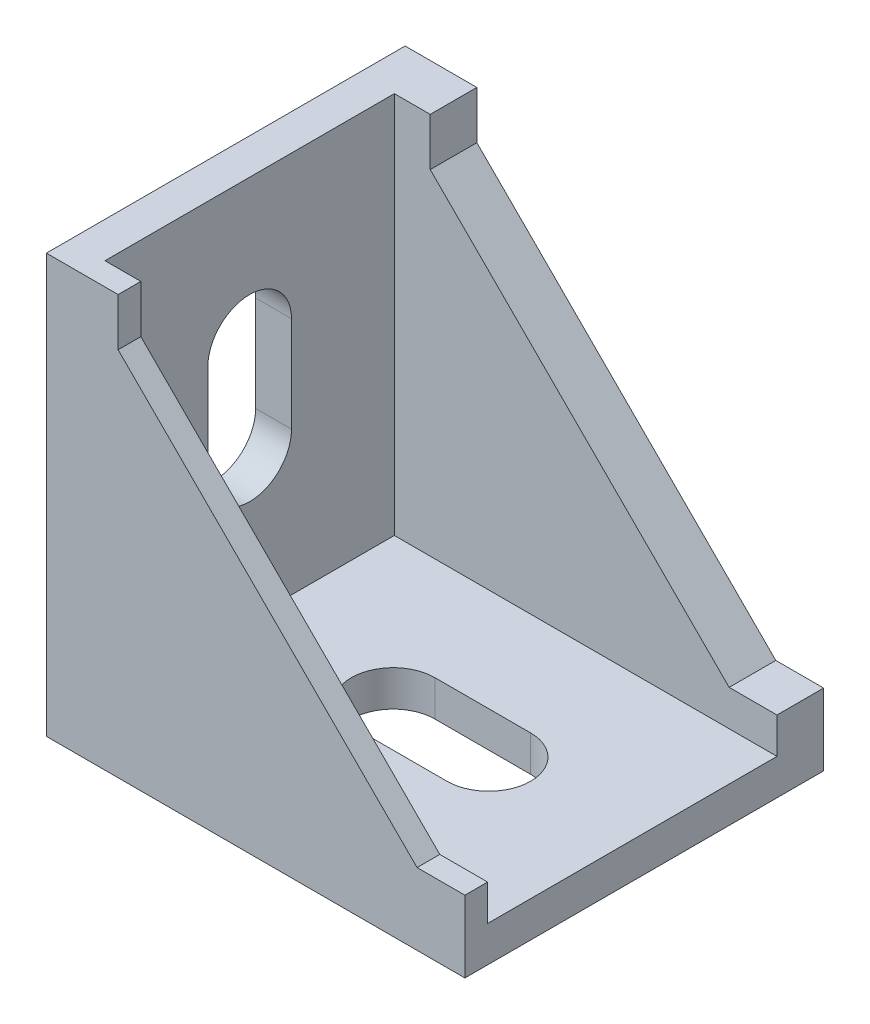
ISO-10303-21;
HEADER;
FILE_DESCRIPTION(('STEP AP214'),'2;1');
FILE_NAME('part.step','',(''),(''),'','','');
FILE_SCHEMA(('AUTOMOTIVE_DESIGN { 1 0 10303 214 1 1 1 1 }'));
ENDSEC;
DATA;
#1=APPLICATION_CONTEXT('core data for automotive mechanical design processes');
#2=APPLICATION_PROTOCOL_DEFINITION('international standard','automotive_design',2000,#1);
#3=PRODUCT_CONTEXT('',#1,'mechanical');
#4=PRODUCT('Part','Part','',(#3));
#5=PRODUCT_RELATED_PRODUCT_CATEGORY('part','',(#4));
#6=PRODUCT_DEFINITION_FORMATION('','',#4);
#7=PRODUCT_DEFINITION_CONTEXT('part definition',#1,'design');
#8=PRODUCT_DEFINITION('design','',#6,#7);
#9=PRODUCT_DEFINITION_SHAPE('','',#8);
#10=(LENGTH_UNIT() NAMED_UNIT(*) SI_UNIT(.MILLI.,.METRE.));
#11=(NAMED_UNIT(*) PLANE_ANGLE_UNIT() SI_UNIT($,.RADIAN.));
#12=(NAMED_UNIT(*) SI_UNIT($,.STERADIAN.) SOLID_ANGLE_UNIT());
#13=UNCERTAINTY_MEASURE_WITH_UNIT(LENGTH_MEASURE(1.E-05),#10,'distance_accuracy_value','');
#14=(GEOMETRIC_REPRESENTATION_CONTEXT(3) GLOBAL_UNCERTAINTY_ASSIGNED_CONTEXT((#13)) GLOBAL_UNIT_ASSIGNED_CONTEXT((#10,
#11,#12)) REPRESENTATION_CONTEXT('',''));
#15=CARTESIAN_POINT('',(0.,0.,0.));
#16=DIRECTION('',(0.,0.,1.));
#17=DIRECTION('',(1.,0.,0.));
#18=AXIS2_PLACEMENT_3D('',#15,#16,#17);
#19=CARTESIAN_POINT('',(3.,17.5,-15.));
#20=DIRECTION('',(0.,1.,0.));
#21=DIRECTION('',(-1.,0.,0.));
#22=AXIS2_PLACEMENT_3D('',#19,#20,#21);
#23=PLANE('',#22);
#24=DIRECTION('',(0.,0.,1.));
#25=VECTOR('',#24,1.);
#26=CARTESIAN_POINT('',(1.50000000000003,17.5,-13.05));
#27=LINE('',#26,#25);
#28=CARTESIAN_POINT('',(1.50000000000003,17.5,-13.05));
#29=VERTEX_POINT('',#28);
#30=CARTESIAN_POINT('',(1.50000000000003,17.5,-0.95));
#31=VERTEX_POINT('',#30);
#32=EDGE_CURVE('E253',#29,#31,#27,.T.);
#33=ORIENTED_EDGE('',*,*,#32,.F.);
#34=DIRECTION('',(-1.,0.,0.));
#35=VECTOR('',#34,1.);
#36=CARTESIAN_POINT('',(3.,17.5,-13.05));
#37=LINE('',#36,#35);
#38=CARTESIAN_POINT('',(3.,17.5,-13.05));
#39=VERTEX_POINT('',#38);
#40=EDGE_CURVE('E241',#39,#29,#37,.T.);
#41=ORIENTED_EDGE('',*,*,#40,.F.);
#42=DIRECTION('',(0.,0.,1.));
#43=VECTOR('',#42,1.);
#44=CARTESIAN_POINT('',(3.,17.5,-15.));
#45=LINE('',#44,#43);
#46=CARTESIAN_POINT('',(3.,17.5,-15.));
#47=VERTEX_POINT('',#46);
#48=EDGE_CURVE('E328',#47,#39,#45,.T.);
#49=ORIENTED_EDGE('',*,*,#48,.F.);
#50=DIRECTION('',(-1.,0.,0.));
#51=VECTOR('',#50,1.);
#52=CARTESIAN_POINT('',(3.,17.5,-15.));
#53=LINE('',#52,#51);
#54=CARTESIAN_POINT('',(0.,17.5,-15.));
#55=VERTEX_POINT('',#54);
#56=EDGE_CURVE('E286',#47,#55,#53,.T.);
#57=ORIENTED_EDGE('',*,*,#56,.T.);
#58=DIRECTION('',(0.,0.,1.));
#59=VECTOR('',#58,1.);
#60=CARTESIAN_POINT('',(0.,17.5,-15.));
#61=LINE('',#60,#59);
#62=CARTESIAN_POINT('',(0.,17.5,0.));
#63=VERTEX_POINT('',#62);
#64=EDGE_CURVE('E308',#55,#63,#61,.T.);
#65=ORIENTED_EDGE('',*,*,#64,.T.);
#66=DIRECTION('',(-1.,0.,0.));
#67=VECTOR('',#66,1.);
#68=CARTESIAN_POINT('',(3.,17.5,0.));
#69=LINE('',#68,#67);
#70=CARTESIAN_POINT('',(3.,17.5,0.));
#71=VERTEX_POINT('',#70);
#72=EDGE_CURVE('E285',#71,#63,#69,.T.);
#73=ORIENTED_EDGE('',*,*,#72,.F.);
#74=CARTESIAN_POINT('',(3.,17.5,-0.95));
#75=VERTEX_POINT('',#74);
#76=EDGE_CURVE('E332',#75,#71,#45,.T.);
#77=ORIENTED_EDGE('',*,*,#76,.F.);
#78=DIRECTION('',(-1.,0.,0.));
#79=VECTOR('',#78,1.);
#80=CARTESIAN_POINT('',(3.,17.5,-0.95));
#81=LINE('',#80,#79);
#82=EDGE_CURVE('E233',#75,#31,#81,.T.);
#83=ORIENTED_EDGE('',*,*,#82,.T.);
#84=EDGE_LOOP('',(#33,#41,#49,#57,#65,#73,#77,#83));
#85=FACE_BOUND('',#84,.T.);
#86=ADVANCED_FACE('F33',(#85),#23,.T.);
#87=CARTESIAN_POINT('',(3.,15.5,-15.));
#88=DIRECTION('',(1.,0.,0.));
#89=DIRECTION('',(0.,1.,0.));
#90=AXIS2_PLACEMENT_3D('',#87,#88,#89);
#91=PLANE('',#90);
#92=ORIENTED_EDGE('',*,*,#48,.T.);
#93=DIRECTION('',(0.,-1.,0.));
#94=VECTOR('',#93,1.);
#95=CARTESIAN_POINT('',(3.,15.5,-13.05));
#96=LINE('',#95,#94);
#97=CARTESIAN_POINT('',(3.,15.5,-13.05));
#98=VERTEX_POINT('',#97);
#99=EDGE_CURVE('E282',#39,#98,#96,.T.);
#100=ORIENTED_EDGE('',*,*,#99,.T.);
#101=DIRECTION('',(0.,0.,1.));
#102=VECTOR('',#101,1.);
#103=CARTESIAN_POINT('',(3.,15.5,-15.));
#104=LINE('',#103,#102);
#105=CARTESIAN_POINT('',(3.,15.5,-15.));
#106=VERTEX_POINT('',#105);
#107=EDGE_CURVE('E333',#106,#98,#104,.T.);
#108=ORIENTED_EDGE('',*,*,#107,.F.);
#109=DIRECTION('',(0.,1.,0.));
#110=VECTOR('',#109,1.);
#111=CARTESIAN_POINT('',(3.,15.5,-15.));
#112=LINE('',#111,#110);
#113=EDGE_CURVE('E305',#106,#47,#112,.T.);
#114=ORIENTED_EDGE('',*,*,#113,.T.);
#115=EDGE_LOOP('',(#92,#100,#108,#114));
#116=FACE_BOUND('',#115,.T.);
#117=ADVANCED_FACE('F385',(#116),#91,.T.);
#118=CARTESIAN_POINT('',(15.5000000000003,3.,-15.));
#119=DIRECTION('',(0.707106781186539,0.707106781186556,0.));
#120=DIRECTION('',(-0.707106781186556,0.707106781186539,0.));
#121=AXIS2_PLACEMENT_3D('',#118,#119,#120);
#122=PLANE('',#121);
#123=ORIENTED_EDGE('',*,*,#107,.T.);
#124=DIRECTION('',(0.707106781186556,-0.707106781186539,0.));
#125=VECTOR('',#124,1.);
#126=CARTESIAN_POINT('',(15.5000000000003,3.,-13.05));
#127=LINE('',#126,#125);
#128=CARTESIAN_POINT('',(15.5000000000003,3.,-13.05));
#129=VERTEX_POINT('',#128);
#130=EDGE_CURVE('E279',#98,#129,#127,.T.);
#131=ORIENTED_EDGE('',*,*,#130,.T.);
#132=DIRECTION('',(0.,0.,1.));
#133=VECTOR('',#132,1.);
#134=CARTESIAN_POINT('',(15.5000000000003,3.,-15.));
#135=LINE('',#134,#133);
#136=CARTESIAN_POINT('',(15.5000000000003,3.,-15.));
#137=VERTEX_POINT('',#136);
#138=EDGE_CURVE('E337',#137,#129,#135,.T.);
#139=ORIENTED_EDGE('',*,*,#138,.F.);
#140=DIRECTION('',(-0.707106781186556,0.707106781186539,0.));
#141=VECTOR('',#140,1.);
#142=CARTESIAN_POINT('',(15.5000000000003,3.,-15.));
#143=LINE('',#142,#141);
#144=EDGE_CURVE('E302',#137,#106,#143,.T.);
#145=ORIENTED_EDGE('',*,*,#144,.T.);
#146=EDGE_LOOP('',(#123,#131,#139,#145));
#147=FACE_BOUND('',#146,.T.);
#148=ADVANCED_FACE('F390',(#147),#122,.T.);
#149=CARTESIAN_POINT('',(17.5,3.,-15.));
#150=DIRECTION('',(0.,1.,0.));
#151=DIRECTION('',(-1.,0.,0.));
#152=AXIS2_PLACEMENT_3D('',#149,#150,#151);
#153=PLANE('',#152);
#154=ORIENTED_EDGE('',*,*,#138,.T.);
#155=DIRECTION('',(1.,0.,0.));
#156=VECTOR('',#155,1.);
#157=CARTESIAN_POINT('',(17.5,3.,-13.05));
#158=LINE('',#157,#156);
#159=CARTESIAN_POINT('',(17.5,3.,-13.05));
#160=VERTEX_POINT('',#159);
#161=EDGE_CURVE('E276',#129,#160,#158,.T.);
#162=ORIENTED_EDGE('',*,*,#161,.T.);
#163=DIRECTION('',(0.,0.,1.));
#164=VECTOR('',#163,1.);
#165=CARTESIAN_POINT('',(17.5,3.,-15.));
#166=LINE('',#165,#164);
#167=CARTESIAN_POINT('',(17.5,3.,-15.));
#168=VERTEX_POINT('',#167);
#169=EDGE_CURVE('E341',#168,#160,#166,.T.);
#170=ORIENTED_EDGE('',*,*,#169,.F.);
#171=DIRECTION('',(-1.,0.,0.));
#172=VECTOR('',#171,1.);
#173=CARTESIAN_POINT('',(17.5,3.,-15.));
#174=LINE('',#173,#172);
#175=EDGE_CURVE('E299',#168,#137,#174,.T.);
#176=ORIENTED_EDGE('',*,*,#175,.T.);
#177=EDGE_LOOP('',(#154,#162,#170,#176));
#178=FACE_BOUND('',#177,.T.);
#179=ADVANCED_FACE('F412',(#178),#153,.T.);
#180=CARTESIAN_POINT('',(17.5,0.,-15.));
#181=DIRECTION('',(1.,0.,0.));
#182=DIRECTION('',(0.,1.,0.));
#183=AXIS2_PLACEMENT_3D('',#180,#181,#182);
#184=PLANE('',#183);
#185=ORIENTED_EDGE('',*,*,#169,.T.);
#186=DIRECTION('',(0.,1.,0.));
#187=VECTOR('',#186,1.);
#188=CARTESIAN_POINT('',(17.5,1.5,-13.05));
#189=LINE('',#188,#187);
#190=CARTESIAN_POINT('',(17.5,1.5,-13.05));
#191=VERTEX_POINT('',#190);
#192=EDGE_CURVE('E251',#191,#160,#189,.T.);
#193=ORIENTED_EDGE('',*,*,#192,.F.);
#194=DIRECTION('',(0.,0.,1.));
#195=VECTOR('',#194,1.);
#196=CARTESIAN_POINT('',(17.5,1.5,-13.05));
#197=LINE('',#196,#195);
#198=CARTESIAN_POINT('',(17.5,1.5,-0.95));
#199=VERTEX_POINT('',#198);
#200=EDGE_CURVE('E264',#191,#199,#197,.T.);
#201=ORIENTED_EDGE('',*,*,#200,.T.);
#202=DIRECTION('',(0.,1.,0.));
#203=VECTOR('',#202,1.);
#204=CARTESIAN_POINT('',(17.5,1.5,-0.95));
#205=LINE('',#204,#203);
#206=CARTESIAN_POINT('',(17.5,3.,-0.95));
#207=VERTEX_POINT('',#206);
#208=EDGE_CURVE('E245',#199,#207,#205,.T.);
#209=ORIENTED_EDGE('',*,*,#208,.T.);
#210=CARTESIAN_POINT('',(17.5,3.,0.));
#211=VERTEX_POINT('',#210);
#212=EDGE_CURVE('E344',#207,#211,#166,.T.);
#213=ORIENTED_EDGE('',*,*,#212,.T.);
#214=DIRECTION('',(0.,1.,0.));
#215=VECTOR('',#214,1.);
#216=CARTESIAN_POINT('',(17.5,0.,0.));
#217=LINE('',#216,#215);
#218=CARTESIAN_POINT('',(17.5,0.,0.));
#219=VERTEX_POINT('',#218);
#220=EDGE_CURVE('E317',#219,#211,#217,.T.);
#221=ORIENTED_EDGE('',*,*,#220,.F.);
#222=DIRECTION('',(0.,0.,1.));
#223=VECTOR('',#222,1.);
#224=CARTESIAN_POINT('',(17.5,0.,-15.));
#225=LINE('',#224,#223);
#226=CARTESIAN_POINT('',(17.5,0.,-15.));
#227=VERTEX_POINT('',#226);
#228=EDGE_CURVE('E345',#227,#219,#225,.T.);
#229=ORIENTED_EDGE('',*,*,#228,.F.);
#230=DIRECTION('',(0.,1.,0.));
#231=VECTOR('',#230,1.);
#232=CARTESIAN_POINT('',(17.5,0.,-15.));
#233=LINE('',#232,#231);
#234=EDGE_CURVE('E296',#227,#168,#233,.T.);
#235=ORIENTED_EDGE('',*,*,#234,.T.);
#236=EDGE_LOOP('',(#185,#193,#201,#209,#213,#221,#229,#235));
#237=FACE_BOUND('',#236,.T.);
#238=ADVANCED_FACE('F407',(#237),#184,.T.);
#239=DIRECTION('',(0.,-1.,0.));
#240=VECTOR('',#239,1.);
#241=CARTESIAN_POINT('',(3.,15.5,-0.95));
#242=LINE('',#241,#240);
#243=CARTESIAN_POINT('',(3.,15.5,-0.95));
#244=VERTEX_POINT('',#243);
#245=EDGE_CURVE('E274',#75,#244,#242,.T.);
#246=ORIENTED_EDGE('',*,*,#245,.F.);
#247=ORIENTED_EDGE('',*,*,#76,.T.);
#248=DIRECTION('',(0.,1.,0.));
#249=VECTOR('',#248,1.);
#250=CARTESIAN_POINT('',(3.,15.5,0.));
#251=LINE('',#250,#249);
#252=CARTESIAN_POINT('',(3.,15.5,0.));
#253=VERTEX_POINT('',#252);
#254=EDGE_CURVE('E290',#253,#71,#251,.T.);
#255=ORIENTED_EDGE('',*,*,#254,.F.);
#256=EDGE_CURVE('E336',#244,#253,#104,.T.);
#257=ORIENTED_EDGE('',*,*,#256,.F.);
#258=EDGE_LOOP('',(#246,#247,#255,#257));
#259=FACE_BOUND('',#258,.T.);
#260=ADVANCED_FACE('F393',(#259),#91,.T.);
#261=DIRECTION('',(0.707106781186556,-0.707106781186539,0.));
#262=VECTOR('',#261,1.);
#263=CARTESIAN_POINT('',(15.5000000000003,3.,-0.95));
#264=LINE('',#263,#262);
#265=CARTESIAN_POINT('',(15.5000000000003,3.,-0.95));
#266=VERTEX_POINT('',#265);
#267=EDGE_CURVE('E272',#244,#266,#264,.T.);
#268=ORIENTED_EDGE('',*,*,#267,.F.);
#269=ORIENTED_EDGE('',*,*,#256,.T.);
#270=DIRECTION('',(-0.707106781186556,0.707106781186539,0.));
#271=VECTOR('',#270,1.);
#272=CARTESIAN_POINT('',(15.5000000000003,3.,0.));
#273=LINE('',#272,#271);
#274=CARTESIAN_POINT('',(15.5000000000003,3.,0.));
#275=VERTEX_POINT('',#274);
#276=EDGE_CURVE('E323',#275,#253,#273,.T.);
#277=ORIENTED_EDGE('',*,*,#276,.F.);
#278=EDGE_CURVE('E340',#266,#275,#135,.T.);
#279=ORIENTED_EDGE('',*,*,#278,.F.);
#280=EDGE_LOOP('',(#268,#269,#277,#279));
#281=FACE_BOUND('',#280,.T.);
#282=ADVANCED_FACE('F435',(#281),#122,.T.);
#283=DIRECTION('',(1.,0.,0.));
#284=VECTOR('',#283,1.);
#285=CARTESIAN_POINT('',(17.5,3.,-0.95));
#286=LINE('',#285,#284);
#287=EDGE_CURVE('E267',#266,#207,#286,.T.);
#288=ORIENTED_EDGE('',*,*,#287,.F.);
#289=ORIENTED_EDGE('',*,*,#278,.T.);
#290=DIRECTION('',(-1.,0.,0.));
#291=VECTOR('',#290,1.);
#292=CARTESIAN_POINT('',(17.5,3.,0.));
#293=LINE('',#292,#291);
#294=EDGE_CURVE('E320',#211,#275,#293,.T.);
#295=ORIENTED_EDGE('',*,*,#294,.F.);
#296=ORIENTED_EDGE('',*,*,#212,.F.);
#297=EDGE_LOOP('',(#288,#289,#295,#296));
#298=FACE_BOUND('',#297,.T.);
#299=ADVANCED_FACE('F438',(#298),#153,.T.);
#300=CARTESIAN_POINT('',(0.,0.,-15.));
#301=DIRECTION('',(0.,-1.,0.));
#302=DIRECTION('',(0.,0.,-1.));
#303=AXIS2_PLACEMENT_3D('',#300,#301,#302);
#304=PLANE('',#303);
#305=CARTESIAN_POINT('',(7.50000000000003,0.,-7.));
#306=DIRECTION('',(0.,1.,0.));
#307=DIRECTION('',(0.,0.,1.));
#308=AXIS2_PLACEMENT_3D('',#305,#306,#307);
#309=CIRCLE('',#308,1.75);
#310=CARTESIAN_POINT('',(7.50000000000003,0.,-8.75));
#311=VERTEX_POINT('',#310);
#312=CARTESIAN_POINT('',(7.50000000000003,0.,-5.25));
#313=VERTEX_POINT('',#312);
#314=EDGE_CURVE('E214',#311,#313,#309,.T.);
#315=ORIENTED_EDGE('',*,*,#314,.T.);
#316=DIRECTION('',(1.,0.,0.));
#317=VECTOR('',#316,1.);
#318=CARTESIAN_POINT('',(7.50000000000003,0.,-5.25));
#319=LINE('',#318,#317);
#320=CARTESIAN_POINT('',(11.5,0.,-5.25));
#321=VERTEX_POINT('',#320);
#322=EDGE_CURVE('E220',#313,#321,#319,.T.);
#323=ORIENTED_EDGE('',*,*,#322,.T.);
#324=CARTESIAN_POINT('',(11.5,0.,-7.));
#325=DIRECTION('',(0.,1.,0.));
#326=DIRECTION('',(0.,0.,1.));
#327=AXIS2_PLACEMENT_3D('',#324,#325,#326);
#328=CIRCLE('',#327,1.75);
#329=CARTESIAN_POINT('',(11.5,0.,-8.75));
#330=VERTEX_POINT('',#329);
#331=EDGE_CURVE('E223',#321,#330,#328,.T.);
#332=ORIENTED_EDGE('',*,*,#331,.T.);
#333=DIRECTION('',(-1.,0.,0.));
#334=VECTOR('',#333,1.);
#335=CARTESIAN_POINT('',(7.50000000000003,0.,-8.75));
#336=LINE('',#335,#334);
#337=EDGE_CURVE('E226',#330,#311,#336,.T.);
#338=ORIENTED_EDGE('',*,*,#337,.T.);
#339=EDGE_LOOP('',(#315,#323,#332,#338));
#340=FACE_BOUND('',#339,.T.);
#341=DIRECTION('',(1.,0.,0.));
#342=VECTOR('',#341,1.);
#343=CARTESIAN_POINT('',(0.,0.,0.));
#344=LINE('',#343,#342);
#345=CARTESIAN_POINT('',(0.,0.,0.));
#346=VERTEX_POINT('',#345);
#347=EDGE_CURVE('E314',#346,#219,#344,.T.);
#348=ORIENTED_EDGE('',*,*,#347,.F.);
#349=DIRECTION('',(0.,0.,1.));
#350=VECTOR('',#349,1.);
#351=CARTESIAN_POINT('',(0.,0.,-15.));
#352=LINE('',#351,#350);
#353=CARTESIAN_POINT('',(0.,0.,-15.));
#354=VERTEX_POINT('',#353);
#355=EDGE_CURVE('E347',#354,#346,#352,.T.);
#356=ORIENTED_EDGE('',*,*,#355,.F.);
#357=DIRECTION('',(1.,0.,0.));
#358=VECTOR('',#357,1.);
#359=CARTESIAN_POINT('',(0.,0.,-15.));
#360=LINE('',#359,#358);
#361=EDGE_CURVE('E293',#354,#227,#360,.T.);
#362=ORIENTED_EDGE('',*,*,#361,.T.);
#363=ORIENTED_EDGE('',*,*,#228,.T.);
#364=EDGE_LOOP('',(#348,#356,#362,#363));
#365=FACE_BOUND('',#364,.T.);
#366=ADVANCED_FACE('F367',(#340,#365),#304,.T.);
#367=CARTESIAN_POINT('',(0.,17.5,-15.));
#368=DIRECTION('',(-1.,0.,0.));
#369=DIRECTION('',(0.,-1.,0.));
#370=AXIS2_PLACEMENT_3D('',#367,#368,#369);
#371=PLANE('',#370);
#372=CARTESIAN_POINT('',(0.,7.5,-7.));
#373=DIRECTION('',(1.,0.,0.));
#374=DIRECTION('',(0.,1.,0.));
#375=AXIS2_PLACEMENT_3D('',#372,#373,#374);
#376=CIRCLE('',#375,1.75);
#377=CARTESIAN_POINT('',(0.,7.5,-5.25));
#378=VERTEX_POINT('',#377);
#379=CARTESIAN_POINT('',(0.,7.5,-8.75));
#380=VERTEX_POINT('',#379);
#381=EDGE_CURVE('E183',#378,#380,#376,.T.);
#382=ORIENTED_EDGE('',*,*,#381,.T.);
#383=DIRECTION('',(0.,1.,0.));
#384=VECTOR('',#383,1.);
#385=CARTESIAN_POINT('',(0.,7.5,-8.75));
#386=LINE('',#385,#384);
#387=CARTESIAN_POINT('',(0.,11.5,-8.75));
#388=VERTEX_POINT('',#387);
#389=EDGE_CURVE('E192',#380,#388,#386,.T.);
#390=ORIENTED_EDGE('',*,*,#389,.T.);
#391=CARTESIAN_POINT('',(0.,11.5,-7.));
#392=DIRECTION('',(1.,0.,0.));
#393=DIRECTION('',(0.,1.,0.));
#394=AXIS2_PLACEMENT_3D('',#391,#392,#393);
#395=CIRCLE('',#394,1.75);
#396=CARTESIAN_POINT('',(0.,11.5,-5.25));
#397=VERTEX_POINT('',#396);
#398=EDGE_CURVE('E47',#388,#397,#395,.T.);
#399=ORIENTED_EDGE('',*,*,#398,.T.);
#400=DIRECTION('',(0.,-1.,0.));
#401=VECTOR('',#400,1.);
#402=CARTESIAN_POINT('',(0.,7.5,-5.25));
#403=LINE('',#402,#401);
#404=EDGE_CURVE('E189',#397,#378,#403,.T.);
#405=ORIENTED_EDGE('',*,*,#404,.T.);
#406=EDGE_LOOP('',(#382,#390,#399,#405));
#407=FACE_BOUND('',#406,.T.);
#408=DIRECTION('',(0.,-1.,0.));
#409=VECTOR('',#408,1.);
#410=CARTESIAN_POINT('',(0.,17.5,0.));
#411=LINE('',#410,#409);
#412=EDGE_CURVE('E311',#63,#346,#411,.T.);
#413=ORIENTED_EDGE('',*,*,#412,.F.);
#414=ORIENTED_EDGE('',*,*,#64,.F.);
#415=DIRECTION('',(0.,-1.,0.));
#416=VECTOR('',#415,1.);
#417=CARTESIAN_POINT('',(0.,17.5,-15.));
#418=LINE('',#417,#416);
#419=EDGE_CURVE('E289',#55,#354,#418,.T.);
#420=ORIENTED_EDGE('',*,*,#419,.T.);
#421=ORIENTED_EDGE('',*,*,#355,.T.);
#422=EDGE_LOOP('',(#413,#414,#420,#421));
#423=FACE_BOUND('',#422,.T.);
#424=ADVANCED_FACE('F196',(#407,#423),#371,.T.);
#425=CARTESIAN_POINT('',(0.,0.,-15.));
#426=DIRECTION('',(0.,0.,1.));
#427=DIRECTION('',(1.,0.,0.));
#428=AXIS2_PLACEMENT_3D('',#425,#426,#427);
#429=PLANE('',#428);
#430=ORIENTED_EDGE('',*,*,#56,.F.);
#431=ORIENTED_EDGE('',*,*,#113,.F.);
#432=ORIENTED_EDGE('',*,*,#144,.F.);
#433=ORIENTED_EDGE('',*,*,#175,.F.);
#434=ORIENTED_EDGE('',*,*,#234,.F.);
#435=ORIENTED_EDGE('',*,*,#361,.F.);
#436=ORIENTED_EDGE('',*,*,#419,.F.);
#437=EDGE_LOOP('',(#430,#431,#432,#433,#434,#435,#436));
#438=FACE_BOUND('',#437,.T.);
#439=ADVANCED_FACE('F419',(#438),#429,.F.);
#440=CARTESIAN_POINT('',(0.,0.,0.));
#441=DIRECTION('',(0.,0.,1.));
#442=DIRECTION('',(1.,0.,0.));
#443=AXIS2_PLACEMENT_3D('',#440,#441,#442);
#444=PLANE('',#443);
#445=ORIENTED_EDGE('',*,*,#72,.T.);
#446=ORIENTED_EDGE('',*,*,#412,.T.);
#447=ORIENTED_EDGE('',*,*,#347,.T.);
#448=ORIENTED_EDGE('',*,*,#220,.T.);
#449=ORIENTED_EDGE('',*,*,#294,.T.);
#450=ORIENTED_EDGE('',*,*,#276,.T.);
#451=ORIENTED_EDGE('',*,*,#254,.T.);
#452=EDGE_LOOP('',(#445,#446,#447,#448,#449,#450,#451));
#453=FACE_BOUND('',#452,.T.);
#454=ADVANCED_FACE('F426',(#453),#444,.T.);
#455=CARTESIAN_POINT('',(1.50000000000004,1.5,-13.05));
#456=DIRECTION('',(0.,-1.,0.));
#457=DIRECTION('',(0.,0.,-1.));
#458=AXIS2_PLACEMENT_3D('',#455,#456,#457);
#459=PLANE('',#458);
#460=DIRECTION('',(-1.,0.,0.));
#461=VECTOR('',#460,1.);
#462=CARTESIAN_POINT('',(1.50000000000004,1.5,-5.25));
#463=LINE('',#462,#461);
#464=CARTESIAN_POINT('',(11.5,1.5,-5.25));
#465=VERTEX_POINT('',#464);
#466=CARTESIAN_POINT('',(7.50000000000003,1.5,-5.25));
#467=VERTEX_POINT('',#466);
#468=EDGE_CURVE('E331',#465,#467,#463,.T.);
#469=ORIENTED_EDGE('',*,*,#468,.T.);
#470=CARTESIAN_POINT('',(7.50000000000003,1.5,-7.));
#471=DIRECTION('',(0.,-1.,0.));
#472=DIRECTION('',(0.,0.,-1.));
#473=AXIS2_PLACEMENT_3D('',#470,#471,#472);
#474=CIRCLE('',#473,1.75);
#475=CARTESIAN_POINT('',(7.50000000000003,1.5,-8.75));
#476=VERTEX_POINT('',#475);
#477=EDGE_CURVE('E11',#467,#476,#474,.T.);
#478=ORIENTED_EDGE('',*,*,#477,.T.);
#479=DIRECTION('',(1.,0.,0.));
#480=VECTOR('',#479,1.);
#481=CARTESIAN_POINT('',(1.50000000000004,1.5,-8.75));
#482=LINE('',#481,#480);
#483=CARTESIAN_POINT('',(11.5,1.5,-8.75));
#484=VERTEX_POINT('',#483);
#485=EDGE_CURVE('E40',#476,#484,#482,.T.);
#486=ORIENTED_EDGE('',*,*,#485,.T.);
#487=CARTESIAN_POINT('',(11.5,1.5,-7.));
#488=DIRECTION('',(0.,-1.,0.));
#489=DIRECTION('',(0.,0.,-1.));
#490=AXIS2_PLACEMENT_3D('',#487,#488,#489);
#491=CIRCLE('',#490,1.75);
#492=EDGE_CURVE('E352',#484,#465,#491,.T.);
#493=ORIENTED_EDGE('',*,*,#492,.T.);
#494=EDGE_LOOP('',(#469,#478,#486,#493));
#495=FACE_BOUND('',#494,.T.);
#496=DIRECTION('',(1.,0.,0.));
#497=VECTOR('',#496,1.);
#498=CARTESIAN_POINT('',(1.50000000000004,1.5,-0.95));
#499=LINE('',#498,#497);
#500=CARTESIAN_POINT('',(1.50000000000004,1.5,-0.95));
#501=VERTEX_POINT('',#500);
#502=EDGE_CURVE('E259',#501,#199,#499,.T.);
#503=ORIENTED_EDGE('',*,*,#502,.T.);
#504=ORIENTED_EDGE('',*,*,#200,.F.);
#505=DIRECTION('',(1.,0.,0.));
#506=VECTOR('',#505,1.);
#507=CARTESIAN_POINT('',(1.50000000000004,1.5,-13.05));
#508=LINE('',#507,#506);
#509=CARTESIAN_POINT('',(1.50000000000004,1.5,-13.05));
#510=VERTEX_POINT('',#509);
#511=EDGE_CURVE('E248',#510,#191,#508,.T.);
#512=ORIENTED_EDGE('',*,*,#511,.F.);
#513=DIRECTION('',(0.,0.,1.));
#514=VECTOR('',#513,1.);
#515=CARTESIAN_POINT('',(1.50000000000004,1.5,-13.05));
#516=LINE('',#515,#514);
#517=EDGE_CURVE('E268',#510,#501,#516,.T.);
#518=ORIENTED_EDGE('',*,*,#517,.T.);
#519=EDGE_LOOP('',(#503,#504,#512,#518));
#520=FACE_BOUND('',#519,.T.);
#521=ADVANCED_FACE('F356',(#495,#520),#459,.F.);
#522=CARTESIAN_POINT('',(1.50000000000003,17.5,-13.05));
#523=DIRECTION('',(-1.,0.,0.));
#524=DIRECTION('',(0.,-1.,0.));
#525=AXIS2_PLACEMENT_3D('',#522,#523,#524);
#526=PLANE('',#525);
#527=DIRECTION('',(0.,1.,0.));
#528=VECTOR('',#527,1.);
#529=CARTESIAN_POINT('',(1.50000000000004,7.5,-8.75));
#530=LINE('',#529,#528);
#531=CARTESIAN_POINT('',(1.50000000000004,7.50000000000001,-8.75));
#532=VERTEX_POINT('',#531);
#533=CARTESIAN_POINT('',(1.50000000000003,11.5,-8.75));
#534=VERTEX_POINT('',#533);
#535=EDGE_CURVE('E208',#532,#534,#530,.T.);
#536=ORIENTED_EDGE('',*,*,#535,.F.);
#537=CARTESIAN_POINT('',(1.50000000000004,7.5,-7.));
#538=DIRECTION('',(1.,0.,0.));
#539=DIRECTION('',(0.,1.,0.));
#540=AXIS2_PLACEMENT_3D('',#537,#538,#539);
#541=CIRCLE('',#540,1.75);
#542=CARTESIAN_POINT('',(1.50000000000004,7.5,-5.25));
#543=VERTEX_POINT('',#542);
#544=EDGE_CURVE('E55',#543,#532,#541,.T.);
#545=ORIENTED_EDGE('',*,*,#544,.F.);
#546=DIRECTION('',(0.,-1.,0.));
#547=VECTOR('',#546,1.);
#548=CARTESIAN_POINT('',(1.50000000000004,7.5,-5.25));
#549=LINE('',#548,#547);
#550=CARTESIAN_POINT('',(1.50000000000003,11.5,-5.25));
#551=VERTEX_POINT('',#550);
#552=EDGE_CURVE('E199',#551,#543,#549,.T.);
#553=ORIENTED_EDGE('',*,*,#552,.F.);
#554=CARTESIAN_POINT('',(1.50000000000003,11.5,-7.));
#555=DIRECTION('',(1.,0.,0.));
#556=DIRECTION('',(0.,1.,0.));
#557=AXIS2_PLACEMENT_3D('',#554,#555,#556);
#558=CIRCLE('',#557,1.75);
#559=EDGE_CURVE('E202',#534,#551,#558,.T.);
#560=ORIENTED_EDGE('',*,*,#559,.F.);
#561=EDGE_LOOP('',(#536,#545,#553,#560));
#562=FACE_BOUND('',#561,.T.);
#563=DIRECTION('',(0.,-1.,0.));
#564=VECTOR('',#563,1.);
#565=CARTESIAN_POINT('',(1.50000000000003,17.5,-0.95));
#566=LINE('',#565,#564);
#567=EDGE_CURVE('E256',#31,#501,#566,.T.);
#568=ORIENTED_EDGE('',*,*,#567,.T.);
#569=ORIENTED_EDGE('',*,*,#517,.F.);
#570=DIRECTION('',(0.,-1.,0.));
#571=VECTOR('',#570,1.);
#572=CARTESIAN_POINT('',(1.50000000000003,17.5,-13.05));
#573=LINE('',#572,#571);
#574=EDGE_CURVE('E244',#29,#510,#573,.T.);
#575=ORIENTED_EDGE('',*,*,#574,.F.);
#576=ORIENTED_EDGE('',*,*,#32,.T.);
#577=EDGE_LOOP('',(#568,#569,#575,#576));
#578=FACE_BOUND('',#577,.T.);
#579=ADVANCED_FACE('F399',(#562,#578),#526,.F.);
#580=CARTESIAN_POINT('',(0.,0.,-13.05));
#581=DIRECTION('',(0.,0.,1.));
#582=DIRECTION('',(1.,0.,0.));
#583=AXIS2_PLACEMENT_3D('',#580,#581,#582);
#584=PLANE('',#583);
#585=ORIENTED_EDGE('',*,*,#40,.T.);
#586=ORIENTED_EDGE('',*,*,#574,.T.);
#587=ORIENTED_EDGE('',*,*,#511,.T.);
#588=ORIENTED_EDGE('',*,*,#192,.T.);
#589=ORIENTED_EDGE('',*,*,#161,.F.);
#590=ORIENTED_EDGE('',*,*,#130,.F.);
#591=ORIENTED_EDGE('',*,*,#99,.F.);
#592=EDGE_LOOP('',(#585,#586,#587,#588,#589,#590,#591));
#593=FACE_BOUND('',#592,.T.);
#594=ADVANCED_FACE('F410',(#593),#584,.T.);
#595=CARTESIAN_POINT('',(0.,0.,-0.95));
#596=DIRECTION('',(0.,0.,1.));
#597=DIRECTION('',(1.,0.,0.));
#598=AXIS2_PLACEMENT_3D('',#595,#596,#597);
#599=PLANE('',#598);
#600=ORIENTED_EDGE('',*,*,#245,.T.);
#601=ORIENTED_EDGE('',*,*,#267,.T.);
#602=ORIENTED_EDGE('',*,*,#287,.T.);
#603=ORIENTED_EDGE('',*,*,#208,.F.);
#604=ORIENTED_EDGE('',*,*,#502,.F.);
#605=ORIENTED_EDGE('',*,*,#567,.F.);
#606=ORIENTED_EDGE('',*,*,#82,.F.);
#607=EDGE_LOOP('',(#600,#601,#602,#603,#604,#605,#606));
#608=FACE_BOUND('',#607,.T.);
#609=ADVANCED_FACE('F402',(#608),#599,.F.);
#610=CARTESIAN_POINT('',(7.50000000000003,0.,-7.));
#611=DIRECTION('',(0.,1.,0.));
#612=DIRECTION('',(0.,0.,1.));
#613=AXIS2_PLACEMENT_3D('',#610,#611,#612);
#614=CYLINDRICAL_SURFACE('',#613,1.75);
#615=DIRECTION('',(0.,1.,0.));
#616=VECTOR('',#615,1.);
#617=CARTESIAN_POINT('',(7.50000000000003,0.,-5.25));
#618=LINE('',#617,#616);
#619=EDGE_CURVE('E229',#313,#467,#618,.T.);
#620=ORIENTED_EDGE('',*,*,#619,.F.);
#621=ORIENTED_EDGE('',*,*,#314,.F.);
#622=DIRECTION('',(0.,1.,0.));
#623=VECTOR('',#622,1.);
#624=CARTESIAN_POINT('',(7.50000000000003,0.,-8.75));
#625=LINE('',#624,#623);
#626=EDGE_CURVE('E230',#311,#476,#625,.T.);
#627=ORIENTED_EDGE('',*,*,#626,.T.);
#628=ORIENTED_EDGE('',*,*,#477,.F.);
#629=EDGE_LOOP('',(#620,#621,#627,#628));
#630=FACE_BOUND('',#629,.T.);
#631=ADVANCED_FACE('F364',(#630),#614,.F.);
#632=CARTESIAN_POINT('',(7.50000000000003,0.,-8.75));
#633=DIRECTION('',(0.,0.,-1.));
#634=DIRECTION('',(-1.,0.,0.));
#635=AXIS2_PLACEMENT_3D('',#632,#633,#634);
#636=PLANE('',#635);
#637=ORIENTED_EDGE('',*,*,#626,.F.);
#638=ORIENTED_EDGE('',*,*,#337,.F.);
#639=DIRECTION('',(0.,1.,0.));
#640=VECTOR('',#639,1.);
#641=CARTESIAN_POINT('',(11.5,0.,-8.75));
#642=LINE('',#641,#640);
#643=EDGE_CURVE('E234',#330,#484,#642,.T.);
#644=ORIENTED_EDGE('',*,*,#643,.T.);
#645=ORIENTED_EDGE('',*,*,#485,.F.);
#646=EDGE_LOOP('',(#637,#638,#644,#645));
#647=FACE_BOUND('',#646,.T.);
#648=ADVANCED_FACE('F360',(#647),#636,.F.);
#649=CARTESIAN_POINT('',(11.5,0.,-7.));
#650=DIRECTION('',(0.,1.,0.));
#651=DIRECTION('',(0.,0.,1.));
#652=AXIS2_PLACEMENT_3D('',#649,#650,#651);
#653=CYLINDRICAL_SURFACE('',#652,1.75);
#654=ORIENTED_EDGE('',*,*,#643,.F.);
#655=ORIENTED_EDGE('',*,*,#331,.F.);
#656=DIRECTION('',(0.,1.,0.));
#657=VECTOR('',#656,1.);
#658=CARTESIAN_POINT('',(11.5,0.,-5.25));
#659=LINE('',#658,#657);
#660=EDGE_CURVE('E237',#321,#465,#659,.T.);
#661=ORIENTED_EDGE('',*,*,#660,.T.);
#662=ORIENTED_EDGE('',*,*,#492,.F.);
#663=EDGE_LOOP('',(#654,#655,#661,#662));
#664=FACE_BOUND('',#663,.T.);
#665=ADVANCED_FACE('F371',(#664),#653,.F.);
#666=CARTESIAN_POINT('',(7.50000000000003,0.,-5.25));
#667=DIRECTION('',(0.,0.,1.));
#668=DIRECTION('',(1.,0.,0.));
#669=AXIS2_PLACEMENT_3D('',#666,#667,#668);
#670=PLANE('',#669);
#671=ORIENTED_EDGE('',*,*,#660,.F.);
#672=ORIENTED_EDGE('',*,*,#322,.F.);
#673=ORIENTED_EDGE('',*,*,#619,.T.);
#674=ORIENTED_EDGE('',*,*,#468,.F.);
#675=EDGE_LOOP('',(#671,#672,#673,#674));
#676=FACE_BOUND('',#675,.T.);
#677=ADVANCED_FACE('F373',(#676),#670,.F.);
#678=CARTESIAN_POINT('',(0.,7.5,-7.));
#679=DIRECTION('',(1.,0.,0.));
#680=DIRECTION('',(0.,1.,0.));
#681=AXIS2_PLACEMENT_3D('',#678,#679,#680);
#682=CYLINDRICAL_SURFACE('',#681,1.75);
#683=ORIENTED_EDGE('',*,*,#544,.T.);
#684=DIRECTION('',(1.,0.,0.));
#685=VECTOR('',#684,1.);
#686=CARTESIAN_POINT('',(0.,7.5,-8.75));
#687=LINE('',#686,#685);
#688=EDGE_CURVE('E179',#380,#532,#687,.T.);
#689=ORIENTED_EDGE('',*,*,#688,.F.);
#690=ORIENTED_EDGE('',*,*,#381,.F.);
#691=DIRECTION('',(1.,0.,0.));
#692=VECTOR('',#691,1.);
#693=CARTESIAN_POINT('',(0.,7.5,-5.25));
#694=LINE('',#693,#692);
#695=EDGE_CURVE('E212',#378,#543,#694,.T.);
#696=ORIENTED_EDGE('',*,*,#695,.T.);
#697=EDGE_LOOP('',(#683,#689,#690,#696));
#698=FACE_BOUND('',#697,.T.);
#699=ADVANCED_FACE('F181',(#698),#682,.F.);
#700=CARTESIAN_POINT('',(0.,7.5,-5.25));
#701=DIRECTION('',(0.,0.,1.));
#702=DIRECTION('',(0.,-1.,0.));
#703=AXIS2_PLACEMENT_3D('',#700,#701,#702);
#704=PLANE('',#703);
#705=ORIENTED_EDGE('',*,*,#552,.T.);
#706=ORIENTED_EDGE('',*,*,#695,.F.);
#707=ORIENTED_EDGE('',*,*,#404,.F.);
#708=DIRECTION('',(1.,0.,0.));
#709=VECTOR('',#708,1.);
#710=CARTESIAN_POINT('',(0.,11.5,-5.25));
#711=LINE('',#710,#709);
#712=EDGE_CURVE('E215',#397,#551,#711,.T.);
#713=ORIENTED_EDGE('',*,*,#712,.T.);
#714=EDGE_LOOP('',(#705,#706,#707,#713));
#715=FACE_BOUND('',#714,.T.);
#716=ADVANCED_FACE('F380',(#715),#704,.F.);
#717=CARTESIAN_POINT('',(0.,11.5,-7.));
#718=DIRECTION('',(1.,0.,0.));
#719=DIRECTION('',(0.,1.,0.));
#720=AXIS2_PLACEMENT_3D('',#717,#718,#719);
#721=CYLINDRICAL_SURFACE('',#720,1.75);
#722=ORIENTED_EDGE('',*,*,#559,.T.);
#723=ORIENTED_EDGE('',*,*,#712,.F.);
#724=ORIENTED_EDGE('',*,*,#398,.F.);
#725=DIRECTION('',(1.,0.,0.));
#726=VECTOR('',#725,1.);
#727=CARTESIAN_POINT('',(0.,11.5,-8.75));
#728=LINE('',#727,#726);
#729=EDGE_CURVE('E188',#388,#534,#728,.T.);
#730=ORIENTED_EDGE('',*,*,#729,.T.);
#731=EDGE_LOOP('',(#722,#723,#724,#730));
#732=FACE_BOUND('',#731,.T.);
#733=ADVANCED_FACE('F476',(#732),#721,.F.);
#734=CARTESIAN_POINT('',(0.,7.5,-8.75));
#735=DIRECTION('',(0.,0.,-1.));
#736=DIRECTION('',(0.,1.,0.));
#737=AXIS2_PLACEMENT_3D('',#734,#735,#736);
#738=PLANE('',#737);
#739=ORIENTED_EDGE('',*,*,#535,.T.);
#740=ORIENTED_EDGE('',*,*,#729,.F.);
#741=ORIENTED_EDGE('',*,*,#389,.F.);
#742=ORIENTED_EDGE('',*,*,#688,.T.);
#743=EDGE_LOOP('',(#739,#740,#741,#742));
#744=FACE_BOUND('',#743,.T.);
#745=ADVANCED_FACE('F193',(#744),#738,.F.);
#746=CLOSED_SHELL('',(#86,#117,#148,#179,#238,#260,#282,#299,#366,#424,#439,#454,#521,#579,#594,
#609,#631,#648,#665,#677,#699,#716,#733,#745));
#747=MANIFOLD_SOLID_BREP('B2',#746);
#748=ADVANCED_BREP_SHAPE_REPRESENTATION('',(#18,#747),#14);
#749=SHAPE_DEFINITION_REPRESENTATION(#9,#748);
ENDSEC;
END-ISO-10303-21;
